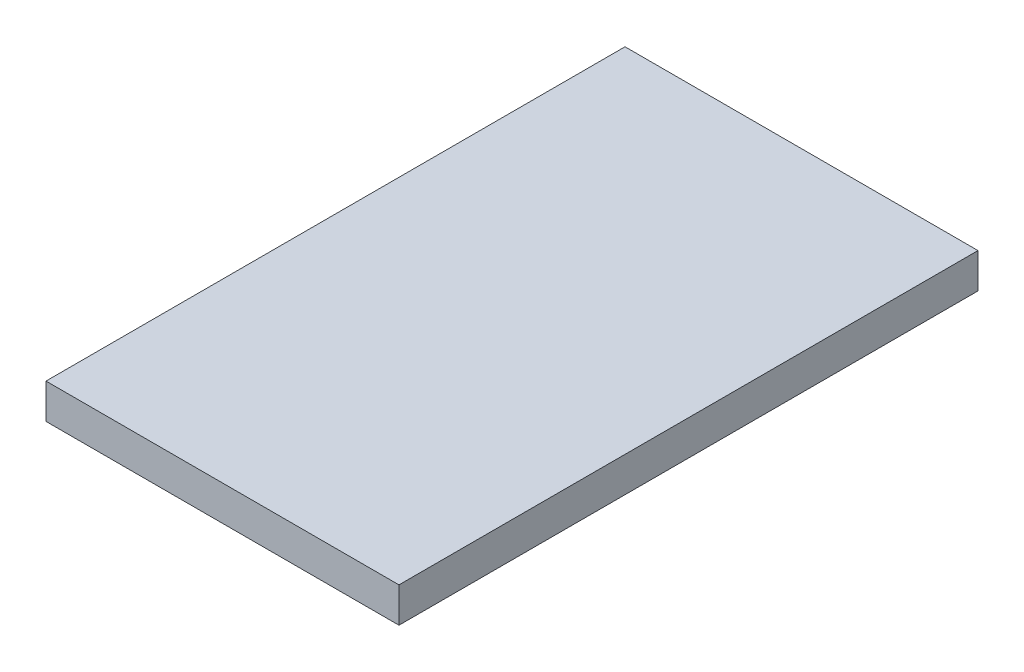
ISO-10303-21;
HEADER;
FILE_DESCRIPTION(('STEP AP214'),'2;1');
FILE_NAME('part.step','',(''),(''),'','','');
FILE_SCHEMA(('AUTOMOTIVE_DESIGN { 1 0 10303 214 1 1 1 1 }'));
ENDSEC;
DATA;
#1=APPLICATION_CONTEXT('core data for automotive mechanical design processes');
#2=APPLICATION_PROTOCOL_DEFINITION('international standard','automotive_design',2000,#1);
#3=PRODUCT_CONTEXT('',#1,'mechanical');
#4=PRODUCT('Part','Part','',(#3));
#5=PRODUCT_RELATED_PRODUCT_CATEGORY('part','',(#4));
#6=PRODUCT_DEFINITION_FORMATION('','',#4);
#7=PRODUCT_DEFINITION_CONTEXT('part definition',#1,'design');
#8=PRODUCT_DEFINITION('design','',#6,#7);
#9=PRODUCT_DEFINITION_SHAPE('','',#8);
#10=(LENGTH_UNIT() NAMED_UNIT(*) SI_UNIT(.MILLI.,.METRE.));
#11=(NAMED_UNIT(*) PLANE_ANGLE_UNIT() SI_UNIT($,.RADIAN.));
#12=(NAMED_UNIT(*) SI_UNIT($,.STERADIAN.) SOLID_ANGLE_UNIT());
#13=UNCERTAINTY_MEASURE_WITH_UNIT(LENGTH_MEASURE(1.E-05),#10,'distance_accuracy_value','');
#14=(GEOMETRIC_REPRESENTATION_CONTEXT(3) GLOBAL_UNCERTAINTY_ASSIGNED_CONTEXT((#13)) GLOBAL_UNIT_ASSIGNED_CONTEXT((#10,
#11,#12)) REPRESENTATION_CONTEXT('',''));
#15=CARTESIAN_POINT('',(0.,0.,0.));
#16=DIRECTION('',(0.,0.,1.));
#17=DIRECTION('',(1.,0.,0.));
#18=AXIS2_PLACEMENT_3D('',#15,#16,#17);
#19=CARTESIAN_POINT('',(0.,11.8872,0.));
#20=DIRECTION('',(1.,0.,0.));
#21=DIRECTION('',(0.,0.,-1.));
#22=AXIS2_PLACEMENT_3D('',#19,#20,#21);
#23=PLANE('',#22);
#24=DIRECTION('',(0.,0.,1.));
#25=VECTOR('',#24,1.);
#26=CARTESIAN_POINT('',(0.,0.,0.));
#27=LINE('',#26,#25);
#28=CARTESIAN_POINT('',(0.,0.,-196.85));
#29=VERTEX_POINT('',#28);
#30=CARTESIAN_POINT('',(0.,0.,0.));
#31=VERTEX_POINT('',#30);
#32=EDGE_CURVE('E96',#29,#31,#27,.T.);
#33=ORIENTED_EDGE('',*,*,#32,.T.);
#34=DIRECTION('',(0.,-1.,0.));
#35=VECTOR('',#34,1.);
#36=CARTESIAN_POINT('',(0.,11.8872,0.));
#37=LINE('',#36,#35);
#38=CARTESIAN_POINT('',(0.,11.8872,0.));
#39=VERTEX_POINT('',#38);
#40=EDGE_CURVE('E11',#39,#31,#37,.T.);
#41=ORIENTED_EDGE('',*,*,#40,.F.);
#42=DIRECTION('',(0.,0.,1.));
#43=VECTOR('',#42,1.);
#44=CARTESIAN_POINT('',(0.,11.8872,0.));
#45=LINE('',#44,#43);
#46=CARTESIAN_POINT('',(0.,11.8872,-196.85));
#47=VERTEX_POINT('',#46);
#48=EDGE_CURVE('E84',#47,#39,#45,.T.);
#49=ORIENTED_EDGE('',*,*,#48,.F.);
#50=DIRECTION('',(0.,-1.,0.));
#51=VECTOR('',#50,1.);
#52=CARTESIAN_POINT('',(0.,11.8872,-196.85));
#53=LINE('',#52,#51);
#54=EDGE_CURVE('E92',#47,#29,#53,.T.);
#55=ORIENTED_EDGE('',*,*,#54,.T.);
#56=EDGE_LOOP('',(#33,#41,#49,#55));
#57=FACE_BOUND('',#56,.T.);
#58=ADVANCED_FACE('F33',(#57),#23,.F.);
#59=CARTESIAN_POINT('',(0.,11.8872,0.));
#60=DIRECTION('',(0.,0.,-1.));
#61=DIRECTION('',(-1.,0.,0.));
#62=AXIS2_PLACEMENT_3D('',#59,#60,#61);
#63=PLANE('',#62);
#64=DIRECTION('',(1.,0.,0.));
#65=VECTOR('',#64,1.);
#66=CARTESIAN_POINT('',(0.,0.,0.));
#67=LINE('',#66,#65);
#68=CARTESIAN_POINT('',(120.,0.,0.));
#69=VERTEX_POINT('',#68);
#70=EDGE_CURVE('E88',#31,#69,#67,.T.);
#71=ORIENTED_EDGE('',*,*,#70,.T.);
#72=DIRECTION('',(0.,-1.,0.));
#73=VECTOR('',#72,1.);
#74=CARTESIAN_POINT('',(120.,11.8872,0.));
#75=LINE('',#74,#73);
#76=CARTESIAN_POINT('',(120.,11.8872,0.));
#77=VERTEX_POINT('',#76);
#78=EDGE_CURVE('E41',#77,#69,#75,.T.);
#79=ORIENTED_EDGE('',*,*,#78,.F.);
#80=DIRECTION('',(1.,0.,0.));
#81=VECTOR('',#80,1.);
#82=CARTESIAN_POINT('',(0.,11.8872,0.));
#83=LINE('',#82,#81);
#84=EDGE_CURVE('E79',#39,#77,#83,.T.);
#85=ORIENTED_EDGE('',*,*,#84,.F.);
#86=ORIENTED_EDGE('',*,*,#40,.T.);
#87=EDGE_LOOP('',(#71,#79,#85,#86));
#88=FACE_BOUND('',#87,.T.);
#89=ADVANCED_FACE('F87',(#88),#63,.F.);
#90=CARTESIAN_POINT('',(120.,11.8872,0.));
#91=DIRECTION('',(-1.,0.,0.));
#92=DIRECTION('',(0.,0.,1.));
#93=AXIS2_PLACEMENT_3D('',#90,#91,#92);
#94=PLANE('',#93);
#95=DIRECTION('',(0.,0.,-1.));
#96=VECTOR('',#95,1.);
#97=CARTESIAN_POINT('',(120.,0.,0.));
#98=LINE('',#97,#96);
#99=CARTESIAN_POINT('',(120.,0.,-196.85));
#100=VERTEX_POINT('',#99);
#101=EDGE_CURVE('E66',#69,#100,#98,.T.);
#102=ORIENTED_EDGE('',*,*,#101,.T.);
#103=DIRECTION('',(0.,-1.,0.));
#104=VECTOR('',#103,1.);
#105=CARTESIAN_POINT('',(120.,11.8872,-196.85));
#106=LINE('',#105,#104);
#107=CARTESIAN_POINT('',(120.,11.8872,-196.85));
#108=VERTEX_POINT('',#107);
#109=EDGE_CURVE('E89',#108,#100,#106,.T.);
#110=ORIENTED_EDGE('',*,*,#109,.F.);
#111=DIRECTION('',(0.,0.,-1.));
#112=VECTOR('',#111,1.);
#113=CARTESIAN_POINT('',(120.,11.8872,0.));
#114=LINE('',#113,#112);
#115=EDGE_CURVE('E82',#77,#108,#114,.T.);
#116=ORIENTED_EDGE('',*,*,#115,.F.);
#117=ORIENTED_EDGE('',*,*,#78,.T.);
#118=EDGE_LOOP('',(#102,#110,#116,#117));
#119=FACE_BOUND('',#118,.T.);
#120=ADVANCED_FACE('F90',(#119),#94,.F.);
#121=CARTESIAN_POINT('',(0.,11.8872,-196.85));
#122=DIRECTION('',(0.,0.,1.));
#123=DIRECTION('',(1.,0.,0.));
#124=AXIS2_PLACEMENT_3D('',#121,#122,#123);
#125=PLANE('',#124);
#126=DIRECTION('',(-1.,0.,0.));
#127=VECTOR('',#126,1.);
#128=CARTESIAN_POINT('',(0.,0.,-196.85));
#129=LINE('',#128,#127);
#130=EDGE_CURVE('E72',#100,#29,#129,.T.);
#131=ORIENTED_EDGE('',*,*,#130,.T.);
#132=ORIENTED_EDGE('',*,*,#54,.F.);
#133=DIRECTION('',(-1.,0.,0.));
#134=VECTOR('',#133,1.);
#135=CARTESIAN_POINT('',(0.,11.8872,-196.85));
#136=LINE('',#135,#134);
#137=EDGE_CURVE('E49',#108,#47,#136,.T.);
#138=ORIENTED_EDGE('',*,*,#137,.F.);
#139=ORIENTED_EDGE('',*,*,#109,.T.);
#140=EDGE_LOOP('',(#131,#132,#138,#139));
#141=FACE_BOUND('',#140,.T.);
#142=ADVANCED_FACE('F103',(#141),#125,.F.);
#143=CARTESIAN_POINT('',(0.,11.8872,0.));
#144=DIRECTION('',(0.,-1.,0.));
#145=DIRECTION('',(0.,0.,-1.));
#146=AXIS2_PLACEMENT_3D('',#143,#144,#145);
#147=PLANE('',#146);
#148=ORIENTED_EDGE('',*,*,#48,.T.);
#149=ORIENTED_EDGE('',*,*,#84,.T.);
#150=ORIENTED_EDGE('',*,*,#115,.T.);
#151=ORIENTED_EDGE('',*,*,#137,.T.);
#152=EDGE_LOOP('',(#148,#149,#150,#151));
#153=FACE_BOUND('',#152,.T.);
#154=ADVANCED_FACE('F80',(#153),#147,.F.);
#155=CARTESIAN_POINT('',(0.,0.,0.));
#156=DIRECTION('',(0.,-1.,0.));
#157=DIRECTION('',(0.,0.,-1.));
#158=AXIS2_PLACEMENT_3D('',#155,#156,#157);
#159=PLANE('',#158);
#160=ORIENTED_EDGE('',*,*,#32,.F.);
#161=ORIENTED_EDGE('',*,*,#130,.F.);
#162=ORIENTED_EDGE('',*,*,#101,.F.);
#163=ORIENTED_EDGE('',*,*,#70,.F.);
#164=EDGE_LOOP('',(#160,#161,#162,#163));
#165=FACE_BOUND('',#164,.T.);
#166=ADVANCED_FACE('F106',(#165),#159,.T.);
#167=CLOSED_SHELL('',(#58,#89,#120,#142,#154,#166));
#168=MANIFOLD_SOLID_BREP('B2',#167);
#169=ADVANCED_BREP_SHAPE_REPRESENTATION('',(#18,#168),#14);
#170=SHAPE_DEFINITION_REPRESENTATION(#9,#169);
ENDSEC;
END-ISO-10303-21;
